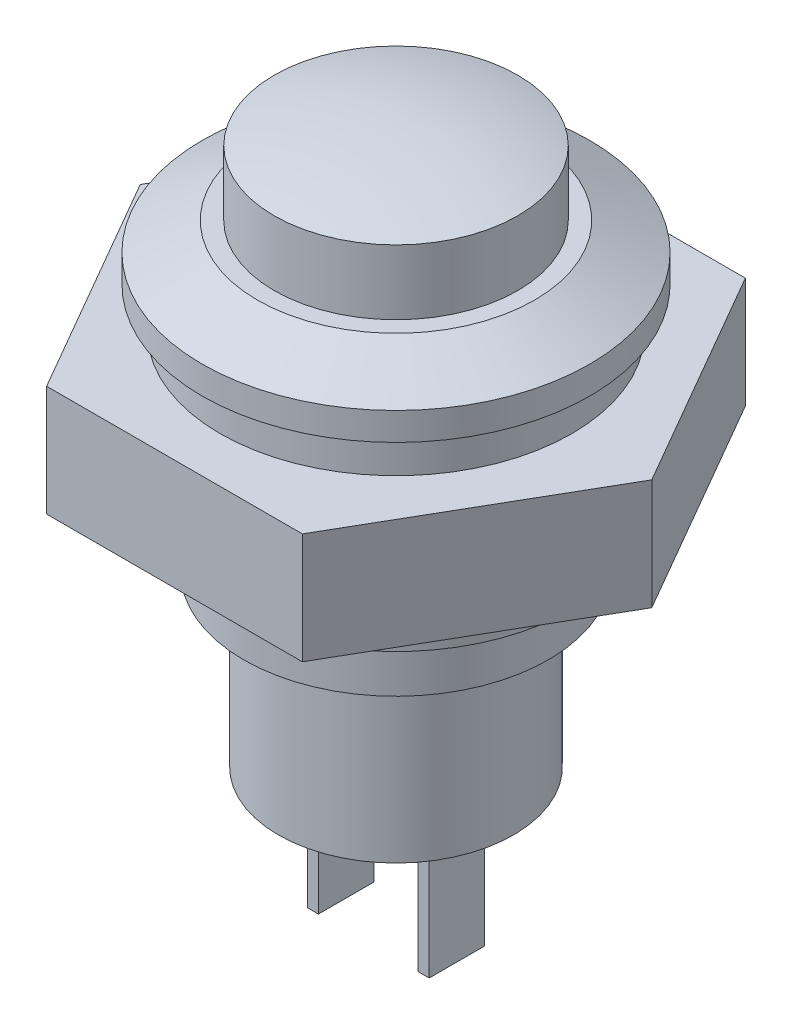
ISO-10303-21;
HEADER;
FILE_DESCRIPTION(('STEP AP214'),'2;1');
FILE_NAME('part.step','',(''),(''),'','','');
FILE_SCHEMA(('AUTOMOTIVE_DESIGN { 1 0 10303 214 1 1 1 1 }'));
ENDSEC;
DATA;
#1=APPLICATION_CONTEXT('core data for automotive mechanical design processes');
#2=APPLICATION_PROTOCOL_DEFINITION('international standard','automotive_design',2000,#1);
#3=PRODUCT_CONTEXT('',#1,'mechanical');
#4=PRODUCT('Part','Part','',(#3));
#5=PRODUCT_RELATED_PRODUCT_CATEGORY('part','',(#4));
#6=PRODUCT_DEFINITION_FORMATION('','',#4);
#7=PRODUCT_DEFINITION_CONTEXT('part definition',#1,'design');
#8=PRODUCT_DEFINITION('design','',#6,#7);
#9=PRODUCT_DEFINITION_SHAPE('','',#8);
#10=(LENGTH_UNIT() NAMED_UNIT(*) SI_UNIT(.MILLI.,.METRE.));
#11=(NAMED_UNIT(*) PLANE_ANGLE_UNIT() SI_UNIT($,.RADIAN.));
#12=(NAMED_UNIT(*) SI_UNIT($,.STERADIAN.) SOLID_ANGLE_UNIT());
#13=UNCERTAINTY_MEASURE_WITH_UNIT(LENGTH_MEASURE(1.E-05),#10,'distance_accuracy_value','');
#14=(GEOMETRIC_REPRESENTATION_CONTEXT(3) GLOBAL_UNCERTAINTY_ASSIGNED_CONTEXT((#13)) GLOBAL_UNIT_ASSIGNED_CONTEXT((#10,
#11,#12)) REPRESENTATION_CONTEXT('',''));
#15=CARTESIAN_POINT('',(0.,0.,0.));
#16=DIRECTION('',(0.,0.,1.));
#17=DIRECTION('',(1.,0.,0.));
#18=AXIS2_PLACEMENT_3D('',#15,#16,#17);
#19=CARTESIAN_POINT('',(4.25,-15.1,0.));
#20=DIRECTION('',(0.,1.,0.));
#21=DIRECTION('',(0.,0.,1.));
#22=AXIS2_PLACEMENT_3D('',#19,#20,#21);
#23=PLANE('',#22);
#24=DIRECTION('',(-1.,0.,0.));
#25=VECTOR('',#24,1.);
#26=CARTESIAN_POINT('',(2.2,-15.1,-1.));
#27=LINE('',#26,#25);
#28=CARTESIAN_POINT('',(2.2,-15.1,-1.));
#29=VERTEX_POINT('',#28);
#30=CARTESIAN_POINT('',(1.8,-15.1,-1.));
#31=VERTEX_POINT('',#30);
#32=EDGE_CURVE('E168',#29,#31,#27,.T.);
#33=ORIENTED_EDGE('',*,*,#32,.T.);
#34=DIRECTION('',(0.,0.,1.));
#35=VECTOR('',#34,1.);
#36=CARTESIAN_POINT('',(1.8,-15.1,1.));
#37=LINE('',#36,#35);
#38=CARTESIAN_POINT('',(1.8,-15.1,1.));
#39=VERTEX_POINT('',#38);
#40=EDGE_CURVE('E142',#31,#39,#37,.T.);
#41=ORIENTED_EDGE('',*,*,#40,.T.);
#42=DIRECTION('',(1.,0.,0.));
#43=VECTOR('',#42,1.);
#44=CARTESIAN_POINT('',(2.2,-15.1,0.999999999999999));
#45=LINE('',#44,#43);
#46=CARTESIAN_POINT('',(2.2,-15.1,0.999999999999999));
#47=VERTEX_POINT('',#46);
#48=EDGE_CURVE('E158',#39,#47,#45,.T.);
#49=ORIENTED_EDGE('',*,*,#48,.T.);
#50=DIRECTION('',(0.,0.,-1.));
#51=VECTOR('',#50,1.);
#52=CARTESIAN_POINT('',(2.2,-15.1,0.999999999999999));
#53=LINE('',#52,#51);
#54=EDGE_CURVE('E50',#47,#29,#53,.T.);
#55=ORIENTED_EDGE('',*,*,#54,.T.);
#56=EDGE_LOOP('',(#33,#41,#49,#55));
#57=FACE_BOUND('',#56,.T.);
#58=CARTESIAN_POINT('',(0.,-15.1,0.));
#59=DIRECTION('',(0.,1.,0.));
#60=DIRECTION('',(0.,0.,1.));
#61=AXIS2_PLACEMENT_3D('',#58,#59,#60);
#62=CIRCLE('',#61,4.25);
#63=CARTESIAN_POINT('',(0.,-15.1,4.25));
#64=VERTEX_POINT('',#63);
#65=EDGE_CURVE('E251',#64,#64,#62,.T.);
#66=ORIENTED_EDGE('',*,*,#65,.F.);
#67=EDGE_LOOP('',(#66));
#68=FACE_BOUND('',#67,.T.);
#69=DIRECTION('',(0.,0.,1.));
#70=VECTOR('',#69,1.);
#71=CARTESIAN_POINT('',(-1.8,-15.1,1.));
#72=LINE('',#71,#70);
#73=CARTESIAN_POINT('',(-1.8,-15.1,-1.));
#74=VERTEX_POINT('',#73);
#75=CARTESIAN_POINT('',(-1.8,-15.1,1.));
#76=VERTEX_POINT('',#75);
#77=EDGE_CURVE('E147',#74,#76,#72,.T.);
#78=ORIENTED_EDGE('',*,*,#77,.F.);
#79=DIRECTION('',(1.,0.,0.));
#80=VECTOR('',#79,1.);
#81=CARTESIAN_POINT('',(-2.2,-15.1,-1.));
#82=LINE('',#81,#80);
#83=CARTESIAN_POINT('',(-2.2,-15.1,-1.));
#84=VERTEX_POINT('',#83);
#85=EDGE_CURVE('E181',#84,#74,#82,.T.);
#86=ORIENTED_EDGE('',*,*,#85,.F.);
#87=DIRECTION('',(0.,0.,-1.));
#88=VECTOR('',#87,1.);
#89=CARTESIAN_POINT('',(-2.2,-15.1,0.999999999999999));
#90=LINE('',#89,#88);
#91=CARTESIAN_POINT('',(-2.2,-15.1,0.999999999999999));
#92=VERTEX_POINT('',#91);
#93=EDGE_CURVE('E191',#92,#84,#90,.T.);
#94=ORIENTED_EDGE('',*,*,#93,.F.);
#95=DIRECTION('',(-1.,0.,0.));
#96=VECTOR('',#95,1.);
#97=CARTESIAN_POINT('',(-2.2,-15.1,0.999999999999999));
#98=LINE('',#97,#96);
#99=EDGE_CURVE('E58',#76,#92,#98,.T.);
#100=ORIENTED_EDGE('',*,*,#99,.F.);
#101=EDGE_LOOP('',(#78,#86,#94,#100));
#102=FACE_BOUND('',#101,.T.);
#103=ADVANCED_FACE('F35',(#57,#68,#102),#23,.F.);
#104=CARTESIAN_POINT('',(0.,15.5745119317284,0.));
#105=DIRECTION('',(0.,1.,0.));
#106=DIRECTION('',(0.,0.,1.));
#107=AXIS2_PLACEMENT_3D('',#104,#105,#106);
#108=CYLINDRICAL_SURFACE('',#107,6.35);
#109=CARTESIAN_POINT('',(0.,-5.5,0.));
#110=DIRECTION('',(0.,-1.,0.));
#111=DIRECTION('',(0.,0.,-1.));
#112=AXIS2_PLACEMENT_3D('',#109,#110,#111);
#113=CIRCLE('',#112,6.35);
#114=CARTESIAN_POINT('',(0.,-5.5,-6.35));
#115=VERTEX_POINT('',#114);
#116=EDGE_CURVE('E250',#115,#115,#113,.T.);
#117=ORIENTED_EDGE('',*,*,#116,.T.);
#118=EDGE_LOOP('',(#117));
#119=FACE_BOUND('',#118,.T.);
#120=CARTESIAN_POINT('',(0.,-7.,0.));
#121=DIRECTION('',(0.,1.,0.));
#122=DIRECTION('',(0.,0.,1.));
#123=AXIS2_PLACEMENT_3D('',#120,#121,#122);
#124=CIRCLE('',#123,6.35);
#125=CARTESIAN_POINT('',(0.,-7.,6.35));
#126=VERTEX_POINT('',#125);
#127=EDGE_CURVE('E263',#126,#126,#124,.T.);
#128=ORIENTED_EDGE('',*,*,#127,.T.);
#129=EDGE_LOOP('',(#128));
#130=FACE_BOUND('',#129,.T.);
#131=ADVANCED_FACE('F302',(#119,#130),#108,.T.);
#132=CARTESIAN_POINT('',(6.35,-7.,0.));
#133=DIRECTION('',(0.,1.,0.));
#134=DIRECTION('',(0.,0.,1.));
#135=AXIS2_PLACEMENT_3D('',#132,#133,#134);
#136=PLANE('',#135);
#137=ORIENTED_EDGE('',*,*,#127,.F.);
#138=EDGE_LOOP('',(#137));
#139=FACE_BOUND('',#138,.T.);
#140=CARTESIAN_POINT('',(0.,-7.,0.));
#141=DIRECTION('',(0.,1.,0.));
#142=DIRECTION('',(0.,0.,1.));
#143=AXIS2_PLACEMENT_3D('',#140,#141,#142);
#144=CIRCLE('',#143,5.5);
#145=CARTESIAN_POINT('',(0.,-7.,5.5));
#146=VERTEX_POINT('',#145);
#147=EDGE_CURVE('E260',#146,#146,#144,.T.);
#148=ORIENTED_EDGE('',*,*,#147,.T.);
#149=EDGE_LOOP('',(#148));
#150=FACE_BOUND('',#149,.T.);
#151=ADVANCED_FACE('F310',(#139,#150),#136,.F.);
#152=CARTESIAN_POINT('',(0.,15.5745119317284,0.));
#153=DIRECTION('',(0.,1.,0.));
#154=DIRECTION('',(0.,0.,1.));
#155=AXIS2_PLACEMENT_3D('',#152,#153,#154);
#156=CYLINDRICAL_SURFACE('',#155,5.5);
#157=ORIENTED_EDGE('',*,*,#147,.F.);
#158=EDGE_LOOP('',(#157));
#159=FACE_BOUND('',#158,.T.);
#160=CARTESIAN_POINT('',(0.,-9.,0.));
#161=DIRECTION('',(0.,1.,0.));
#162=DIRECTION('',(0.,0.,1.));
#163=AXIS2_PLACEMENT_3D('',#160,#161,#162);
#164=CIRCLE('',#163,5.5);
#165=CARTESIAN_POINT('',(0.,-9.,5.5));
#166=VERTEX_POINT('',#165);
#167=EDGE_CURVE('E257',#166,#166,#164,.T.);
#168=ORIENTED_EDGE('',*,*,#167,.T.);
#169=EDGE_LOOP('',(#168));
#170=FACE_BOUND('',#169,.T.);
#171=ADVANCED_FACE('F324',(#159,#170),#156,.T.);
#172=CARTESIAN_POINT('',(5.5,-9.,0.));
#173=DIRECTION('',(0.,1.,0.));
#174=DIRECTION('',(0.,0.,1.));
#175=AXIS2_PLACEMENT_3D('',#172,#173,#174);
#176=PLANE('',#175);
#177=ORIENTED_EDGE('',*,*,#167,.F.);
#178=EDGE_LOOP('',(#177));
#179=FACE_BOUND('',#178,.T.);
#180=CARTESIAN_POINT('',(0.,-9.,0.));
#181=DIRECTION('',(0.,1.,0.));
#182=DIRECTION('',(0.,0.,1.));
#183=AXIS2_PLACEMENT_3D('',#180,#181,#182);
#184=CIRCLE('',#183,4.25);
#185=CARTESIAN_POINT('',(0.,-9.,4.25));
#186=VERTEX_POINT('',#185);
#187=EDGE_CURVE('E254',#186,#186,#184,.T.);
#188=ORIENTED_EDGE('',*,*,#187,.T.);
#189=EDGE_LOOP('',(#188));
#190=FACE_BOUND('',#189,.T.);
#191=ADVANCED_FACE('F320',(#179,#190),#176,.F.);
#192=CARTESIAN_POINT('',(0.,15.5745119317284,0.));
#193=DIRECTION('',(0.,1.,0.));
#194=DIRECTION('',(0.,0.,1.));
#195=AXIS2_PLACEMENT_3D('',#192,#193,#194);
#196=CYLINDRICAL_SURFACE('',#195,4.25);
#197=ORIENTED_EDGE('',*,*,#187,.F.);
#198=EDGE_LOOP('',(#197));
#199=FACE_BOUND('',#198,.T.);
#200=ORIENTED_EDGE('',*,*,#65,.T.);
#201=EDGE_LOOP('',(#200));
#202=FACE_BOUND('',#201,.T.);
#203=ADVANCED_FACE('F317',(#199,#202),#196,.T.);
#204=CARTESIAN_POINT('',(-4.61880215351701,-5.5,-8.));
#205=DIRECTION('',(0.,0.,1.));
#206=DIRECTION('',(1.,0.,0.));
#207=AXIS2_PLACEMENT_3D('',#204,#205,#206);
#208=PLANE('',#207);
#209=DIRECTION('',(1.,0.,0.));
#210=VECTOR('',#209,1.);
#211=CARTESIAN_POINT('',(-4.61880215351701,-1.5,-8.));
#212=LINE('',#211,#210);
#213=CARTESIAN_POINT('',(-4.61880215351701,-1.5,-8.));
#214=VERTEX_POINT('',#213);
#215=CARTESIAN_POINT('',(4.61880215351701,-1.5,-8.));
#216=VERTEX_POINT('',#215);
#217=EDGE_CURVE('E206',#214,#216,#212,.T.);
#218=ORIENTED_EDGE('',*,*,#217,.T.);
#219=DIRECTION('',(0.,1.,0.));
#220=VECTOR('',#219,1.);
#221=CARTESIAN_POINT('',(4.61880215351701,-5.5,-8.));
#222=LINE('',#221,#220);
#223=CARTESIAN_POINT('',(4.61880215351701,-5.5,-8.));
#224=VERTEX_POINT('',#223);
#225=EDGE_CURVE('E247',#224,#216,#222,.T.);
#226=ORIENTED_EDGE('',*,*,#225,.F.);
#227=DIRECTION('',(1.,0.,0.));
#228=VECTOR('',#227,1.);
#229=CARTESIAN_POINT('',(-4.61880215351701,-5.5,-8.));
#230=LINE('',#229,#228);
#231=CARTESIAN_POINT('',(-4.61880215351701,-5.5,-8.));
#232=VERTEX_POINT('',#231);
#233=EDGE_CURVE('E207',#232,#224,#230,.T.);
#234=ORIENTED_EDGE('',*,*,#233,.F.);
#235=DIRECTION('',(0.,1.,0.));
#236=VECTOR('',#235,1.);
#237=CARTESIAN_POINT('',(-4.61880215351701,-5.5,-8.));
#238=LINE('',#237,#236);
#239=EDGE_CURVE('E221',#232,#214,#238,.T.);
#240=ORIENTED_EDGE('',*,*,#239,.T.);
#241=EDGE_LOOP('',(#218,#226,#234,#240));
#242=FACE_BOUND('',#241,.T.);
#243=ADVANCED_FACE('F315',(#242),#208,.F.);
#244=CARTESIAN_POINT('',(4.61880215351701,-5.5,-8.));
#245=DIRECTION('',(-0.866025403784439,0.,0.5));
#246=DIRECTION('',(0.5,0.,0.866025403784439));
#247=AXIS2_PLACEMENT_3D('',#244,#245,#246);
#248=PLANE('',#247);
#249=DIRECTION('',(0.5,0.,0.866025403784439));
#250=VECTOR('',#249,1.);
#251=CARTESIAN_POINT('',(4.61880215351701,-1.5,-8.));
#252=LINE('',#251,#250);
#253=CARTESIAN_POINT('',(9.23760430703401,-1.5,0.));
#254=VERTEX_POINT('',#253);
#255=EDGE_CURVE('E224',#216,#254,#252,.T.);
#256=ORIENTED_EDGE('',*,*,#255,.T.);
#257=DIRECTION('',(0.,1.,0.));
#258=VECTOR('',#257,1.);
#259=CARTESIAN_POINT('',(9.23760430703401,-5.5,0.));
#260=LINE('',#259,#258);
#261=CARTESIAN_POINT('',(9.23760430703401,-5.5,0.));
#262=VERTEX_POINT('',#261);
#263=EDGE_CURVE('E244',#262,#254,#260,.T.);
#264=ORIENTED_EDGE('',*,*,#263,.F.);
#265=DIRECTION('',(0.5,0.,0.866025403784439));
#266=VECTOR('',#265,1.);
#267=CARTESIAN_POINT('',(4.61880215351701,-5.5,-8.));
#268=LINE('',#267,#266);
#269=EDGE_CURVE('E210',#224,#262,#268,.T.);
#270=ORIENTED_EDGE('',*,*,#269,.F.);
#271=ORIENTED_EDGE('',*,*,#225,.T.);
#272=EDGE_LOOP('',(#256,#264,#270,#271));
#273=FACE_BOUND('',#272,.T.);
#274=ADVANCED_FACE('F378',(#273),#248,.F.);
#275=CARTESIAN_POINT('',(9.23760430703401,-5.5,0.));
#276=DIRECTION('',(-0.866025403784438,0.,-0.5));
#277=DIRECTION('',(-0.5,0.,0.866025403784438));
#278=AXIS2_PLACEMENT_3D('',#275,#276,#277);
#279=PLANE('',#278);
#280=DIRECTION('',(-0.5,0.,0.866025403784438));
#281=VECTOR('',#280,1.);
#282=CARTESIAN_POINT('',(9.23760430703401,-1.5,0.));
#283=LINE('',#282,#281);
#284=CARTESIAN_POINT('',(4.618802153517,-1.5,8.));
#285=VERTEX_POINT('',#284);
#286=EDGE_CURVE('E226',#254,#285,#283,.T.);
#287=ORIENTED_EDGE('',*,*,#286,.T.);
#288=DIRECTION('',(0.,1.,0.));
#289=VECTOR('',#288,1.);
#290=CARTESIAN_POINT('',(4.618802153517,-5.5,8.));
#291=LINE('',#290,#289);
#292=CARTESIAN_POINT('',(4.618802153517,-5.5,8.));
#293=VERTEX_POINT('',#292);
#294=EDGE_CURVE('E241',#293,#285,#291,.T.);
#295=ORIENTED_EDGE('',*,*,#294,.F.);
#296=DIRECTION('',(-0.5,0.,0.866025403784438));
#297=VECTOR('',#296,1.);
#298=CARTESIAN_POINT('',(9.23760430703401,-5.5,0.));
#299=LINE('',#298,#297);
#300=EDGE_CURVE('E213',#262,#293,#299,.T.);
#301=ORIENTED_EDGE('',*,*,#300,.F.);
#302=ORIENTED_EDGE('',*,*,#263,.T.);
#303=EDGE_LOOP('',(#287,#295,#301,#302));
#304=FACE_BOUND('',#303,.T.);
#305=ADVANCED_FACE('F375',(#304),#279,.F.);
#306=CARTESIAN_POINT('',(4.618802153517,-5.5,8.));
#307=DIRECTION('',(0.,0.,-1.));
#308=DIRECTION('',(-1.,0.,0.));
#309=AXIS2_PLACEMENT_3D('',#306,#307,#308);
#310=PLANE('',#309);
#311=DIRECTION('',(-1.,0.,0.));
#312=VECTOR('',#311,1.);
#313=CARTESIAN_POINT('',(4.618802153517,-1.5,8.));
#314=LINE('',#313,#312);
#315=CARTESIAN_POINT('',(-4.61880215351701,-1.5,8.));
#316=VERTEX_POINT('',#315);
#317=EDGE_CURVE('E228',#285,#316,#314,.T.);
#318=ORIENTED_EDGE('',*,*,#317,.T.);
#319=DIRECTION('',(0.,1.,0.));
#320=VECTOR('',#319,1.);
#321=CARTESIAN_POINT('',(-4.61880215351701,-5.5,8.));
#322=LINE('',#321,#320);
#323=CARTESIAN_POINT('',(-4.61880215351701,-5.5,8.));
#324=VERTEX_POINT('',#323);
#325=EDGE_CURVE('E238',#324,#316,#322,.T.);
#326=ORIENTED_EDGE('',*,*,#325,.F.);
#327=DIRECTION('',(-1.,0.,0.));
#328=VECTOR('',#327,1.);
#329=CARTESIAN_POINT('',(4.618802153517,-5.5,8.));
#330=LINE('',#329,#328);
#331=EDGE_CURVE('E215',#293,#324,#330,.T.);
#332=ORIENTED_EDGE('',*,*,#331,.F.);
#333=ORIENTED_EDGE('',*,*,#294,.T.);
#334=EDGE_LOOP('',(#318,#326,#332,#333));
#335=FACE_BOUND('',#334,.T.);
#336=ADVANCED_FACE('F371',(#335),#310,.F.);
#337=CARTESIAN_POINT('',(-4.61880215351701,-5.5,8.));
#338=DIRECTION('',(0.866025403784439,0.,-0.5));
#339=DIRECTION('',(-0.5,0.,-0.866025403784439));
#340=AXIS2_PLACEMENT_3D('',#337,#338,#339);
#341=PLANE('',#340);
#342=DIRECTION('',(-0.5,0.,-0.866025403784439));
#343=VECTOR('',#342,1.);
#344=CARTESIAN_POINT('',(-4.61880215351701,-1.5,8.));
#345=LINE('',#344,#343);
#346=CARTESIAN_POINT('',(-9.23760430703401,-1.5,0.));
#347=VERTEX_POINT('',#346);
#348=EDGE_CURVE('E230',#316,#347,#345,.T.);
#349=ORIENTED_EDGE('',*,*,#348,.T.);
#350=DIRECTION('',(0.,1.,0.));
#351=VECTOR('',#350,1.);
#352=CARTESIAN_POINT('',(-9.23760430703401,-5.5,0.));
#353=LINE('',#352,#351);
#354=CARTESIAN_POINT('',(-9.23760430703401,-5.5,0.));
#355=VERTEX_POINT('',#354);
#356=EDGE_CURVE('E235',#355,#347,#353,.T.);
#357=ORIENTED_EDGE('',*,*,#356,.F.);
#358=DIRECTION('',(-0.5,0.,-0.866025403784439));
#359=VECTOR('',#358,1.);
#360=CARTESIAN_POINT('',(-4.61880215351701,-5.5,8.));
#361=LINE('',#360,#359);
#362=EDGE_CURVE('E217',#324,#355,#361,.T.);
#363=ORIENTED_EDGE('',*,*,#362,.F.);
#364=ORIENTED_EDGE('',*,*,#325,.T.);
#365=EDGE_LOOP('',(#349,#357,#363,#364));
#366=FACE_BOUND('',#365,.T.);
#367=ADVANCED_FACE('F367',(#366),#341,.F.);
#368=CARTESIAN_POINT('',(-9.23760430703401,-5.5,0.));
#369=DIRECTION('',(0.866025403784439,0.,0.5));
#370=DIRECTION('',(0.5,0.,-0.866025403784438));
#371=AXIS2_PLACEMENT_3D('',#368,#369,#370);
#372=PLANE('',#371);
#373=DIRECTION('',(0.5,0.,-0.866025403784438));
#374=VECTOR('',#373,1.);
#375=CARTESIAN_POINT('',(-9.23760430703401,-1.5,0.));
#376=LINE('',#375,#374);
#377=EDGE_CURVE('E211',#347,#214,#376,.T.);
#378=ORIENTED_EDGE('',*,*,#377,.T.);
#379=ORIENTED_EDGE('',*,*,#239,.F.);
#380=DIRECTION('',(0.5,0.,-0.866025403784438));
#381=VECTOR('',#380,1.);
#382=CARTESIAN_POINT('',(-9.23760430703401,-5.5,0.));
#383=LINE('',#382,#381);
#384=EDGE_CURVE('E219',#355,#232,#383,.T.);
#385=ORIENTED_EDGE('',*,*,#384,.F.);
#386=ORIENTED_EDGE('',*,*,#356,.T.);
#387=EDGE_LOOP('',(#378,#379,#385,#386));
#388=FACE_BOUND('',#387,.T.);
#389=ADVANCED_FACE('F360',(#388),#372,.F.);
#390=CARTESIAN_POINT('',(0.,-5.5,0.));
#391=DIRECTION('',(0.,-1.,0.));
#392=DIRECTION('',(0.,0.,-1.));
#393=AXIS2_PLACEMENT_3D('',#390,#391,#392);
#394=PLANE('',#393);
#395=ORIENTED_EDGE('',*,*,#116,.F.);
#396=EDGE_LOOP('',(#395));
#397=FACE_BOUND('',#396,.T.);
#398=ORIENTED_EDGE('',*,*,#233,.T.);
#399=ORIENTED_EDGE('',*,*,#269,.T.);
#400=ORIENTED_EDGE('',*,*,#300,.T.);
#401=ORIENTED_EDGE('',*,*,#331,.T.);
#402=ORIENTED_EDGE('',*,*,#362,.T.);
#403=ORIENTED_EDGE('',*,*,#384,.T.);
#404=EDGE_LOOP('',(#398,#399,#400,#401,#402,#403));
#405=FACE_BOUND('',#404,.T.);
#406=ADVANCED_FACE('F351',(#397,#405),#394,.T.);
#407=CARTESIAN_POINT('',(0.,-1.5,0.));
#408=DIRECTION('',(0.,-1.,0.));
#409=DIRECTION('',(0.,0.,-1.));
#410=AXIS2_PLACEMENT_3D('',#407,#408,#409);
#411=PLANE('',#410);
#412=CARTESIAN_POINT('',(0.,-1.5,0.));
#413=DIRECTION('',(0.,-1.,0.));
#414=DIRECTION('',(0.,0.,-1.));
#415=AXIS2_PLACEMENT_3D('',#412,#413,#414);
#416=CIRCLE('',#415,6.35);
#417=CARTESIAN_POINT('',(0.,-1.5,-6.35));
#418=VERTEX_POINT('',#417);
#419=EDGE_CURVE('E278',#418,#418,#416,.T.);
#420=ORIENTED_EDGE('',*,*,#419,.T.);
#421=EDGE_LOOP('',(#420));
#422=FACE_BOUND('',#421,.T.);
#423=ORIENTED_EDGE('',*,*,#217,.F.);
#424=ORIENTED_EDGE('',*,*,#377,.F.);
#425=ORIENTED_EDGE('',*,*,#348,.F.);
#426=ORIENTED_EDGE('',*,*,#317,.F.);
#427=ORIENTED_EDGE('',*,*,#286,.F.);
#428=ORIENTED_EDGE('',*,*,#255,.F.);
#429=EDGE_LOOP('',(#423,#424,#425,#426,#427,#428));
#430=FACE_BOUND('',#429,.T.);
#431=ADVANCED_FACE('F346',(#422,#430),#411,.F.);
#432=CARTESIAN_POINT('',(0.,-10.,0.));
#433=DIRECTION('',(0.,1.,0.));
#434=DIRECTION('',(1.,0.,0.));
#435=AXIS2_PLACEMENT_3D('',#432,#433,#434);
#436=SPHERICAL_SURFACE('',#435,15.);
#437=CARTESIAN_POINT('',(0.,4.34015341619468,0.));
#438=DIRECTION('',(0.,1.,0.));
#439=DIRECTION('',(0.,0.,1.));
#440=AXIS2_PLACEMENT_3D('',#437,#438,#439);
#441=CIRCLE('',#440,4.4);
#442=CARTESIAN_POINT('',(0.,4.34015341619468,4.4));
#443=VERTEX_POINT('',#442);
#444=EDGE_CURVE('E275',#443,#443,#441,.T.);
#445=ORIENTED_EDGE('',*,*,#444,.T.);
#446=EDGE_LOOP('',(#445));
#447=FACE_BOUND('',#446,.T.);
#448=ADVANCED_FACE('F343',(#447),#436,.T.);
#449=CARTESIAN_POINT('',(0.,15.5745119317284,0.));
#450=DIRECTION('',(0.,1.,0.));
#451=DIRECTION('',(0.,0.,1.));
#452=AXIS2_PLACEMENT_3D('',#449,#450,#451);
#453=CYLINDRICAL_SURFACE('',#452,4.4);
#454=ORIENTED_EDGE('',*,*,#444,.F.);
#455=EDGE_LOOP('',(#454));
#456=FACE_BOUND('',#455,.T.);
#457=CARTESIAN_POINT('',(0.,2.,0.));
#458=DIRECTION('',(0.,1.,0.));
#459=DIRECTION('',(0.,0.,1.));
#460=AXIS2_PLACEMENT_3D('',#457,#458,#459);
#461=CIRCLE('',#460,4.4);
#462=CARTESIAN_POINT('',(0.,2.,4.4));
#463=VERTEX_POINT('',#462);
#464=EDGE_CURVE('E272',#463,#463,#461,.T.);
#465=ORIENTED_EDGE('',*,*,#464,.T.);
#466=EDGE_LOOP('',(#465));
#467=FACE_BOUND('',#466,.T.);
#468=ADVANCED_FACE('F341',(#456,#467),#453,.T.);
#469=CARTESIAN_POINT('',(4.4,2.,0.));
#470=DIRECTION('',(0.,-1.,0.));
#471=DIRECTION('',(0.,0.,-1.));
#472=AXIS2_PLACEMENT_3D('',#469,#470,#471);
#473=PLANE('',#472);
#474=CARTESIAN_POINT('',(0.,2.,0.));
#475=DIRECTION('',(0.,-1.,0.));
#476=DIRECTION('',(0.,0.,-1.));
#477=AXIS2_PLACEMENT_3D('',#474,#475,#476);
#478=CIRCLE('',#477,4.99999999999999);
#479=CARTESIAN_POINT('',(0.,2.,-4.99999999999999));
#480=VERTEX_POINT('',#479);
#481=EDGE_CURVE('E43',#480,#480,#478,.F.);
#482=ORIENTED_EDGE('',*,*,#481,.T.);
#483=EDGE_LOOP('',(#482));
#484=FACE_BOUND('',#483,.T.);
#485=ORIENTED_EDGE('',*,*,#464,.F.);
#486=EDGE_LOOP('',(#485));
#487=FACE_BOUND('',#486,.T.);
#488=ADVANCED_FACE('F285',(#484,#487),#473,.F.);
#489=CARTESIAN_POINT('',(0.,15.5745119317284,0.));
#490=DIRECTION('',(0.,1.,0.));
#491=DIRECTION('',(0.,0.,1.));
#492=AXIS2_PLACEMENT_3D('',#489,#490,#491);
#493=CYLINDRICAL_SURFACE('',#492,7.);
#494=CARTESIAN_POINT('',(0.,1.,0.));
#495=DIRECTION('',(0.,-1.,0.));
#496=DIRECTION('',(0.,0.,-1.));
#497=AXIS2_PLACEMENT_3D('',#494,#495,#496);
#498=CIRCLE('',#497,7.);
#499=CARTESIAN_POINT('',(0.,1.,-7.));
#500=VERTEX_POINT('',#499);
#501=EDGE_CURVE('E11',#500,#500,#498,.T.);
#502=ORIENTED_EDGE('',*,*,#501,.T.);
#503=EDGE_LOOP('',(#502));
#504=FACE_BOUND('',#503,.T.);
#505=CARTESIAN_POINT('',(0.,0.,0.));
#506=DIRECTION('',(0.,1.,0.));
#507=DIRECTION('',(0.,0.,1.));
#508=AXIS2_PLACEMENT_3D('',#505,#506,#507);
#509=CIRCLE('',#508,7.);
#510=CARTESIAN_POINT('',(0.,0.,7.));
#511=VERTEX_POINT('',#510);
#512=EDGE_CURVE('E269',#511,#511,#509,.T.);
#513=ORIENTED_EDGE('',*,*,#512,.T.);
#514=EDGE_LOOP('',(#513));
#515=FACE_BOUND('',#514,.T.);
#516=ADVANCED_FACE('F334',(#504,#515),#493,.T.);
#517=CARTESIAN_POINT('',(7.,0.,0.));
#518=DIRECTION('',(0.,1.,0.));
#519=DIRECTION('',(0.,0.,1.));
#520=AXIS2_PLACEMENT_3D('',#517,#518,#519);
#521=PLANE('',#520);
#522=ORIENTED_EDGE('',*,*,#512,.F.);
#523=EDGE_LOOP('',(#522));
#524=FACE_BOUND('',#523,.T.);
#525=CARTESIAN_POINT('',(0.,0.,0.));
#526=DIRECTION('',(0.,1.,0.));
#527=DIRECTION('',(0.,0.,1.));
#528=AXIS2_PLACEMENT_3D('',#525,#526,#527);
#529=CIRCLE('',#528,6.35);
#530=CARTESIAN_POINT('',(0.,0.,6.35));
#531=VERTEX_POINT('',#530);
#532=EDGE_CURVE('E266',#531,#531,#529,.T.);
#533=ORIENTED_EDGE('',*,*,#532,.T.);
#534=EDGE_LOOP('',(#533));
#535=FACE_BOUND('',#534,.T.);
#536=ADVANCED_FACE('F299',(#524,#535),#521,.F.);
#537=ORIENTED_EDGE('',*,*,#532,.F.);
#538=EDGE_LOOP('',(#537));
#539=FACE_BOUND('',#538,.T.);
#540=ORIENTED_EDGE('',*,*,#419,.F.);
#541=EDGE_LOOP('',(#540));
#542=FACE_BOUND('',#541,.T.);
#543=ADVANCED_FACE('F290',(#539,#542),#108,.T.);
#544=CARTESIAN_POINT('',(0.,2.,0.));
#545=DIRECTION('',(0.,-1.,0.));
#546=DIRECTION('',(0.,0.,-1.));
#547=AXIS2_PLACEMENT_3D('',#544,#545,#546);
#548=CONICAL_SURFACE('',#547,4.99999999999999,1.10714871779409);
#549=ORIENTED_EDGE('',*,*,#501,.F.);
#550=EDGE_LOOP('',(#549));
#551=FACE_BOUND('',#550,.T.);
#552=ORIENTED_EDGE('',*,*,#481,.F.);
#553=EDGE_LOOP('',(#552));
#554=FACE_BOUND('',#553,.T.);
#555=ADVANCED_FACE('F37',(#551,#554),#548,.T.);
#556=CARTESIAN_POINT('',(-1.8,-20.1,1.));
#557=DIRECTION('',(-1.,0.,0.));
#558=DIRECTION('',(0.,0.,1.));
#559=AXIS2_PLACEMENT_3D('',#556,#557,#558);
#560=PLANE('',#559);
#561=ORIENTED_EDGE('',*,*,#77,.T.);
#562=DIRECTION('',(0.,1.,0.));
#563=VECTOR('',#562,1.);
#564=CARTESIAN_POINT('',(-1.8,-20.1,1.));
#565=LINE('',#564,#563);
#566=CARTESIAN_POINT('',(-1.8,-20.1,1.));
#567=VERTEX_POINT('',#566);
#568=EDGE_CURVE('E204',#567,#76,#565,.T.);
#569=ORIENTED_EDGE('',*,*,#568,.F.);
#570=DIRECTION('',(0.,0.,1.));
#571=VECTOR('',#570,1.);
#572=CARTESIAN_POINT('',(-1.8,-20.1,1.));
#573=LINE('',#572,#571);
#574=CARTESIAN_POINT('',(-1.8,-20.1,-1.));
#575=VERTEX_POINT('',#574);
#576=EDGE_CURVE('E177',#575,#567,#573,.T.);
#577=ORIENTED_EDGE('',*,*,#576,.F.);
#578=DIRECTION('',(0.,1.,0.));
#579=VECTOR('',#578,1.);
#580=CARTESIAN_POINT('',(-1.8,-20.1,-1.));
#581=LINE('',#580,#579);
#582=EDGE_CURVE('E187',#575,#74,#581,.T.);
#583=ORIENTED_EDGE('',*,*,#582,.T.);
#584=EDGE_LOOP('',(#561,#569,#577,#583));
#585=FACE_BOUND('',#584,.T.);
#586=ADVANCED_FACE('F289',(#585),#560,.F.);
#587=CARTESIAN_POINT('',(-2.2,-20.1,0.999999999999999));
#588=DIRECTION('',(0.,0.,-1.));
#589=DIRECTION('',(-1.,0.,0.));
#590=AXIS2_PLACEMENT_3D('',#587,#588,#589);
#591=PLANE('',#590);
#592=ORIENTED_EDGE('',*,*,#99,.T.);
#593=DIRECTION('',(0.,1.,0.));
#594=VECTOR('',#593,1.);
#595=CARTESIAN_POINT('',(-2.2,-20.1,0.999999999999999));
#596=LINE('',#595,#594);
#597=CARTESIAN_POINT('',(-2.2,-20.1,0.999999999999999));
#598=VERTEX_POINT('',#597);
#599=EDGE_CURVE('E201',#598,#92,#596,.T.);
#600=ORIENTED_EDGE('',*,*,#599,.F.);
#601=DIRECTION('',(-1.,0.,0.));
#602=VECTOR('',#601,1.);
#603=CARTESIAN_POINT('',(-2.2,-20.1,0.999999999999999));
#604=LINE('',#603,#602);
#605=EDGE_CURVE('E180',#567,#598,#604,.T.);
#606=ORIENTED_EDGE('',*,*,#605,.F.);
#607=ORIENTED_EDGE('',*,*,#568,.T.);
#608=EDGE_LOOP('',(#592,#600,#606,#607));
#609=FACE_BOUND('',#608,.T.);
#610=ADVANCED_FACE('F296',(#609),#591,.F.);
#611=CARTESIAN_POINT('',(-2.2,-20.1,0.999999999999999));
#612=DIRECTION('',(1.,0.,0.));
#613=DIRECTION('',(0.,0.,-1.));
#614=AXIS2_PLACEMENT_3D('',#611,#612,#613);
#615=PLANE('',#614);
#616=ORIENTED_EDGE('',*,*,#93,.T.);
#617=DIRECTION('',(0.,1.,0.));
#618=VECTOR('',#617,1.);
#619=CARTESIAN_POINT('',(-2.2,-20.1,-1.));
#620=LINE('',#619,#618);
#621=CARTESIAN_POINT('',(-2.2,-20.1,-1.));
#622=VERTEX_POINT('',#621);
#623=EDGE_CURVE('E198',#622,#84,#620,.T.);
#624=ORIENTED_EDGE('',*,*,#623,.F.);
#625=DIRECTION('',(0.,0.,-1.));
#626=VECTOR('',#625,1.);
#627=CARTESIAN_POINT('',(-2.2,-20.1,0.999999999999999));
#628=LINE('',#627,#626);
#629=EDGE_CURVE('E183',#598,#622,#628,.T.);
#630=ORIENTED_EDGE('',*,*,#629,.F.);
#631=ORIENTED_EDGE('',*,*,#599,.T.);
#632=EDGE_LOOP('',(#616,#624,#630,#631));
#633=FACE_BOUND('',#632,.T.);
#634=ADVANCED_FACE('F505',(#633),#615,.F.);
#635=CARTESIAN_POINT('',(-2.2,-20.1,-1.));
#636=DIRECTION('',(0.,0.,1.));
#637=DIRECTION('',(1.,0.,0.));
#638=AXIS2_PLACEMENT_3D('',#635,#636,#637);
#639=PLANE('',#638);
#640=ORIENTED_EDGE('',*,*,#85,.T.);
#641=ORIENTED_EDGE('',*,*,#582,.F.);
#642=DIRECTION('',(1.,0.,0.));
#643=VECTOR('',#642,1.);
#644=CARTESIAN_POINT('',(-2.2,-20.1,-1.));
#645=LINE('',#644,#643);
#646=EDGE_CURVE('E185',#622,#575,#645,.T.);
#647=ORIENTED_EDGE('',*,*,#646,.F.);
#648=ORIENTED_EDGE('',*,*,#623,.T.);
#649=EDGE_LOOP('',(#640,#641,#647,#648));
#650=FACE_BOUND('',#649,.T.);
#651=ADVANCED_FACE('F514',(#650),#639,.F.);
#652=CARTESIAN_POINT('',(0.,-20.1,0.));
#653=DIRECTION('',(0.,-1.,0.));
#654=DIRECTION('',(0.,0.,-1.));
#655=AXIS2_PLACEMENT_3D('',#652,#653,#654);
#656=PLANE('',#655);
#657=ORIENTED_EDGE('',*,*,#576,.T.);
#658=ORIENTED_EDGE('',*,*,#605,.T.);
#659=ORIENTED_EDGE('',*,*,#629,.T.);
#660=ORIENTED_EDGE('',*,*,#646,.T.);
#661=EDGE_LOOP('',(#657,#658,#659,#660));
#662=FACE_BOUND('',#661,.T.);
#663=ADVANCED_FACE('F523',(#662),#656,.T.);
#664=CARTESIAN_POINT('',(1.8,-20.1,1.));
#665=DIRECTION('',(-1.,0.,0.));
#666=DIRECTION('',(0.,0.,1.));
#667=AXIS2_PLACEMENT_3D('',#664,#665,#666);
#668=PLANE('',#667);
#669=ORIENTED_EDGE('',*,*,#40,.F.);
#670=DIRECTION('',(0.,1.,0.));
#671=VECTOR('',#670,1.);
#672=CARTESIAN_POINT('',(1.8,-20.1,-1.));
#673=LINE('',#672,#671);
#674=CARTESIAN_POINT('',(1.8,-20.1,-1.));
#675=VERTEX_POINT('',#674);
#676=EDGE_CURVE('E136',#675,#31,#673,.T.);
#677=ORIENTED_EDGE('',*,*,#676,.F.);
#678=DIRECTION('',(0.,0.,1.));
#679=VECTOR('',#678,1.);
#680=CARTESIAN_POINT('',(1.8,-20.1,1.));
#681=LINE('',#680,#679);
#682=CARTESIAN_POINT('',(1.8,-20.1,1.));
#683=VERTEX_POINT('',#682);
#684=EDGE_CURVE('E139',#675,#683,#681,.T.);
#685=ORIENTED_EDGE('',*,*,#684,.T.);
#686=DIRECTION('',(0.,1.,0.));
#687=VECTOR('',#686,1.);
#688=CARTESIAN_POINT('',(1.8,-20.1,1.));
#689=LINE('',#688,#687);
#690=EDGE_CURVE('E166',#683,#39,#689,.T.);
#691=ORIENTED_EDGE('',*,*,#690,.T.);
#692=EDGE_LOOP('',(#669,#677,#685,#691));
#693=FACE_BOUND('',#692,.T.);
#694=ADVANCED_FACE('F138',(#693),#668,.T.);
#695=CARTESIAN_POINT('',(2.2,-20.1,-1.));
#696=DIRECTION('',(0.,0.,-1.));
#697=DIRECTION('',(-1.,0.,0.));
#698=AXIS2_PLACEMENT_3D('',#695,#696,#697);
#699=PLANE('',#698);
#700=ORIENTED_EDGE('',*,*,#32,.F.);
#701=DIRECTION('',(0.,1.,0.));
#702=VECTOR('',#701,1.);
#703=CARTESIAN_POINT('',(2.2,-20.1,-1.));
#704=LINE('',#703,#702);
#705=CARTESIAN_POINT('',(2.2,-20.1,-1.));
#706=VERTEX_POINT('',#705);
#707=EDGE_CURVE('E148',#706,#29,#704,.T.);
#708=ORIENTED_EDGE('',*,*,#707,.F.);
#709=DIRECTION('',(-1.,0.,0.));
#710=VECTOR('',#709,1.);
#711=CARTESIAN_POINT('',(2.2,-20.1,-1.));
#712=LINE('',#711,#710);
#713=EDGE_CURVE('E154',#706,#675,#712,.T.);
#714=ORIENTED_EDGE('',*,*,#713,.T.);
#715=ORIENTED_EDGE('',*,*,#676,.T.);
#716=EDGE_LOOP('',(#700,#708,#714,#715));
#717=FACE_BOUND('',#716,.T.);
#718=ADVANCED_FACE('F160',(#717),#699,.T.);
#719=CARTESIAN_POINT('',(2.2,-20.1,0.999999999999999));
#720=DIRECTION('',(1.,0.,0.));
#721=DIRECTION('',(0.,0.,-1.));
#722=AXIS2_PLACEMENT_3D('',#719,#720,#721);
#723=PLANE('',#722);
#724=ORIENTED_EDGE('',*,*,#54,.F.);
#725=DIRECTION('',(0.,1.,0.));
#726=VECTOR('',#725,1.);
#727=CARTESIAN_POINT('',(2.2,-20.1,0.999999999999999));
#728=LINE('',#727,#726);
#729=CARTESIAN_POINT('',(2.2,-20.1,0.999999999999999));
#730=VERTEX_POINT('',#729);
#731=EDGE_CURVE('E174',#730,#47,#728,.T.);
#732=ORIENTED_EDGE('',*,*,#731,.F.);
#733=DIRECTION('',(0.,0.,-1.));
#734=VECTOR('',#733,1.);
#735=CARTESIAN_POINT('',(2.2,-20.1,0.999999999999999));
#736=LINE('',#735,#734);
#737=EDGE_CURVE('E161',#730,#706,#736,.T.);
#738=ORIENTED_EDGE('',*,*,#737,.T.);
#739=ORIENTED_EDGE('',*,*,#707,.T.);
#740=EDGE_LOOP('',(#724,#732,#738,#739));
#741=FACE_BOUND('',#740,.T.);
#742=ADVANCED_FACE('F545',(#741),#723,.T.);
#743=CARTESIAN_POINT('',(2.2,-20.1,0.999999999999999));
#744=DIRECTION('',(0.,0.,1.));
#745=DIRECTION('',(1.,0.,0.));
#746=AXIS2_PLACEMENT_3D('',#743,#744,#745);
#747=PLANE('',#746);
#748=ORIENTED_EDGE('',*,*,#48,.F.);
#749=ORIENTED_EDGE('',*,*,#690,.F.);
#750=DIRECTION('',(1.,0.,0.));
#751=VECTOR('',#750,1.);
#752=CARTESIAN_POINT('',(2.2,-20.1,0.999999999999999));
#753=LINE('',#752,#751);
#754=EDGE_CURVE('E157',#683,#730,#753,.T.);
#755=ORIENTED_EDGE('',*,*,#754,.T.);
#756=ORIENTED_EDGE('',*,*,#731,.T.);
#757=EDGE_LOOP('',(#748,#749,#755,#756));
#758=FACE_BOUND('',#757,.T.);
#759=ADVANCED_FACE('F553',(#758),#747,.T.);
#760=CARTESIAN_POINT('',(0.,-20.1,0.));
#761=DIRECTION('',(0.,-1.,0.));
#762=DIRECTION('',(0.,0.,-1.));
#763=AXIS2_PLACEMENT_3D('',#760,#761,#762);
#764=PLANE('',#763);
#765=ORIENTED_EDGE('',*,*,#684,.F.);
#766=ORIENTED_EDGE('',*,*,#713,.F.);
#767=ORIENTED_EDGE('',*,*,#737,.F.);
#768=ORIENTED_EDGE('',*,*,#754,.F.);
#769=EDGE_LOOP('',(#765,#766,#767,#768));
#770=FACE_BOUND('',#769,.T.);
#771=ADVANCED_FACE('F152',(#770),#764,.T.);
#772=CLOSED_SHELL('',(#103,#131,#151,#171,#191,#203,#243,#274,#305,#336,#367,#389,#406,#431,
#448,#468,#488,#516,#536,#543,#555,#586,#610,#634,#651,#663,#694,#718,#742,#759,#771));
#773=MANIFOLD_SOLID_BREP('B2',#772);
#774=ADVANCED_BREP_SHAPE_REPRESENTATION('',(#18,#773),#14);
#775=SHAPE_DEFINITION_REPRESENTATION(#9,#774);
ENDSEC;
END-ISO-10303-21;
